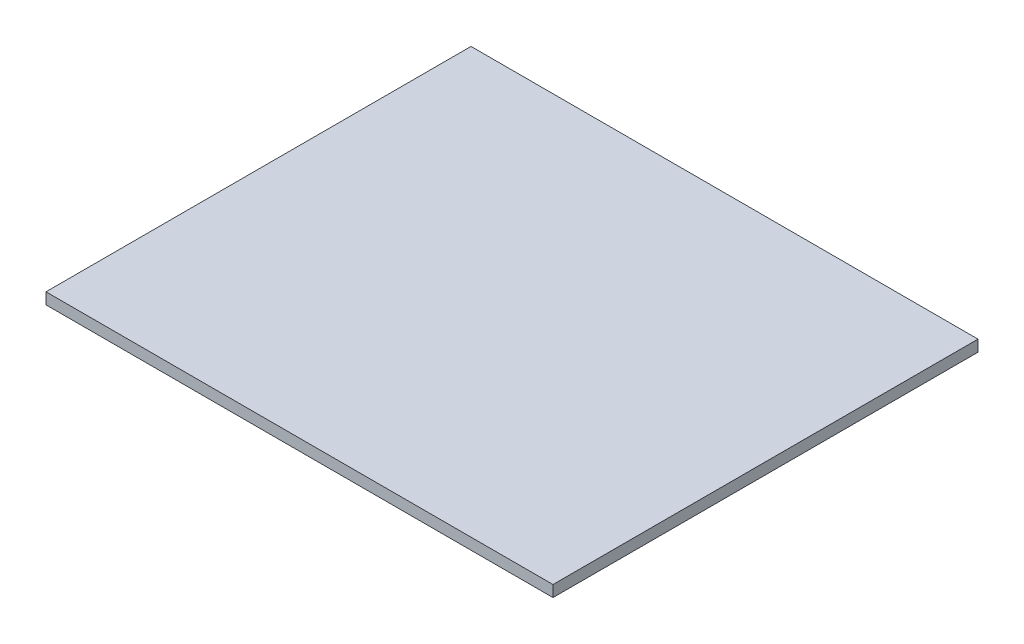
ISO-10303-21;
HEADER;
FILE_DESCRIPTION(('STEP AP214'),'2;1');
FILE_NAME('part.step','',(''),(''),'','','');
FILE_SCHEMA(('AUTOMOTIVE_DESIGN { 1 0 10303 214 1 1 1 1 }'));
ENDSEC;
DATA;
#1=APPLICATION_CONTEXT('core data for automotive mechanical design processes');
#2=APPLICATION_PROTOCOL_DEFINITION('international standard','automotive_design',2000,#1);
#3=PRODUCT_CONTEXT('',#1,'mechanical');
#4=PRODUCT('Part','Part','',(#3));
#5=PRODUCT_RELATED_PRODUCT_CATEGORY('part','',(#4));
#6=PRODUCT_DEFINITION_FORMATION('','',#4);
#7=PRODUCT_DEFINITION_CONTEXT('part definition',#1,'design');
#8=PRODUCT_DEFINITION('design','',#6,#7);
#9=PRODUCT_DEFINITION_SHAPE('','',#8);
#10=(LENGTH_UNIT() NAMED_UNIT(*) SI_UNIT(.MILLI.,.METRE.));
#11=(NAMED_UNIT(*) PLANE_ANGLE_UNIT() SI_UNIT($,.RADIAN.));
#12=(NAMED_UNIT(*) SI_UNIT($,.STERADIAN.) SOLID_ANGLE_UNIT());
#13=UNCERTAINTY_MEASURE_WITH_UNIT(LENGTH_MEASURE(1.E-05),#10,'distance_accuracy_value','');
#14=(GEOMETRIC_REPRESENTATION_CONTEXT(3) GLOBAL_UNCERTAINTY_ASSIGNED_CONTEXT((#13)) GLOBAL_UNIT_ASSIGNED_CONTEXT((#10,
#11,#12)) REPRESENTATION_CONTEXT('',''));
#15=CARTESIAN_POINT('',(0.,0.,0.));
#16=DIRECTION('',(0.,0.,1.));
#17=DIRECTION('',(1.,0.,0.));
#18=AXIS2_PLACEMENT_3D('',#15,#16,#17);
#19=CARTESIAN_POINT('',(178.93175074184,8.,-150.));
#20=DIRECTION('',(-1.,0.,0.));
#21=DIRECTION('',(0.,0.,1.));
#22=AXIS2_PLACEMENT_3D('',#19,#20,#21);
#23=PLANE('',#22);
#24=DIRECTION('',(0.,0.,-1.));
#25=VECTOR('',#24,1.);
#26=CARTESIAN_POINT('',(178.93175074184,0.,-150.));
#27=LINE('',#26,#25);
#28=CARTESIAN_POINT('',(178.93175074184,0.,150.));
#29=VERTEX_POINT('',#28);
#30=CARTESIAN_POINT('',(178.93175074184,0.,-150.));
#31=VERTEX_POINT('',#30);
#32=EDGE_CURVE('E98',#29,#31,#27,.T.);
#33=ORIENTED_EDGE('',*,*,#32,.T.);
#34=DIRECTION('',(0.,-1.,0.));
#35=VECTOR('',#34,1.);
#36=CARTESIAN_POINT('',(178.93175074184,8.,-150.));
#37=LINE('',#36,#35);
#38=CARTESIAN_POINT('',(178.93175074184,8.,-150.));
#39=VERTEX_POINT('',#38);
#40=EDGE_CURVE('E11',#39,#31,#37,.T.);
#41=ORIENTED_EDGE('',*,*,#40,.F.);
#42=DIRECTION('',(0.,0.,-1.));
#43=VECTOR('',#42,1.);
#44=CARTESIAN_POINT('',(178.93175074184,8.,-150.));
#45=LINE('',#44,#43);
#46=CARTESIAN_POINT('',(178.93175074184,8.,150.));
#47=VERTEX_POINT('',#46);
#48=EDGE_CURVE('E86',#47,#39,#45,.T.);
#49=ORIENTED_EDGE('',*,*,#48,.F.);
#50=DIRECTION('',(0.,-1.,0.));
#51=VECTOR('',#50,1.);
#52=CARTESIAN_POINT('',(178.93175074184,8.,150.));
#53=LINE('',#52,#51);
#54=EDGE_CURVE('E94',#47,#29,#53,.T.);
#55=ORIENTED_EDGE('',*,*,#54,.T.);
#56=EDGE_LOOP('',(#33,#41,#49,#55));
#57=FACE_BOUND('',#56,.T.);
#58=ADVANCED_FACE('F35',(#57),#23,.F.);
#59=CARTESIAN_POINT('',(-178.93175074184,8.,-150.));
#60=DIRECTION('',(0.,0.,1.));
#61=DIRECTION('',(1.,0.,0.));
#62=AXIS2_PLACEMENT_3D('',#59,#60,#61);
#63=PLANE('',#62);
#64=DIRECTION('',(-1.,0.,0.));
#65=VECTOR('',#64,1.);
#66=CARTESIAN_POINT('',(-178.93175074184,0.,-150.));
#67=LINE('',#66,#65);
#68=CARTESIAN_POINT('',(-178.93175074184,0.,-150.));
#69=VERTEX_POINT('',#68);
#70=EDGE_CURVE('E90',#31,#69,#67,.T.);
#71=ORIENTED_EDGE('',*,*,#70,.T.);
#72=DIRECTION('',(0.,-1.,0.));
#73=VECTOR('',#72,1.);
#74=CARTESIAN_POINT('',(-178.93175074184,8.,-150.));
#75=LINE('',#74,#73);
#76=CARTESIAN_POINT('',(-178.93175074184,8.,-150.));
#77=VERTEX_POINT('',#76);
#78=EDGE_CURVE('E43',#77,#69,#75,.T.);
#79=ORIENTED_EDGE('',*,*,#78,.F.);
#80=DIRECTION('',(-1.,0.,0.));
#81=VECTOR('',#80,1.);
#82=CARTESIAN_POINT('',(-178.93175074184,8.,-150.));
#83=LINE('',#82,#81);
#84=EDGE_CURVE('E81',#39,#77,#83,.T.);
#85=ORIENTED_EDGE('',*,*,#84,.F.);
#86=ORIENTED_EDGE('',*,*,#40,.T.);
#87=EDGE_LOOP('',(#71,#79,#85,#86));
#88=FACE_BOUND('',#87,.T.);
#89=ADVANCED_FACE('F89',(#88),#63,.F.);
#90=CARTESIAN_POINT('',(-178.93175074184,8.,-150.));
#91=DIRECTION('',(1.,0.,0.));
#92=DIRECTION('',(0.,0.,-1.));
#93=AXIS2_PLACEMENT_3D('',#90,#91,#92);
#94=PLANE('',#93);
#95=DIRECTION('',(0.,0.,1.));
#96=VECTOR('',#95,1.);
#97=CARTESIAN_POINT('',(-178.93175074184,0.,-150.));
#98=LINE('',#97,#96);
#99=CARTESIAN_POINT('',(-178.93175074184,0.,150.));
#100=VERTEX_POINT('',#99);
#101=EDGE_CURVE('E68',#69,#100,#98,.T.);
#102=ORIENTED_EDGE('',*,*,#101,.T.);
#103=DIRECTION('',(0.,-1.,0.));
#104=VECTOR('',#103,1.);
#105=CARTESIAN_POINT('',(-178.93175074184,8.,150.));
#106=LINE('',#105,#104);
#107=CARTESIAN_POINT('',(-178.93175074184,8.,150.));
#108=VERTEX_POINT('',#107);
#109=EDGE_CURVE('E91',#108,#100,#106,.T.);
#110=ORIENTED_EDGE('',*,*,#109,.F.);
#111=DIRECTION('',(0.,0.,1.));
#112=VECTOR('',#111,1.);
#113=CARTESIAN_POINT('',(-178.93175074184,8.,-150.));
#114=LINE('',#113,#112);
#115=EDGE_CURVE('E84',#77,#108,#114,.T.);
#116=ORIENTED_EDGE('',*,*,#115,.F.);
#117=ORIENTED_EDGE('',*,*,#78,.T.);
#118=EDGE_LOOP('',(#102,#110,#116,#117));
#119=FACE_BOUND('',#118,.T.);
#120=ADVANCED_FACE('F92',(#119),#94,.F.);
#121=CARTESIAN_POINT('',(-178.93175074184,8.,150.));
#122=DIRECTION('',(0.,0.,-1.));
#123=DIRECTION('',(-1.,0.,0.));
#124=AXIS2_PLACEMENT_3D('',#121,#122,#123);
#125=PLANE('',#124);
#126=DIRECTION('',(1.,0.,0.));
#127=VECTOR('',#126,1.);
#128=CARTESIAN_POINT('',(-178.93175074184,0.,150.));
#129=LINE('',#128,#127);
#130=EDGE_CURVE('E74',#100,#29,#129,.T.);
#131=ORIENTED_EDGE('',*,*,#130,.T.);
#132=ORIENTED_EDGE('',*,*,#54,.F.);
#133=DIRECTION('',(1.,0.,0.));
#134=VECTOR('',#133,1.);
#135=CARTESIAN_POINT('',(-178.93175074184,8.,150.));
#136=LINE('',#135,#134);
#137=EDGE_CURVE('E51',#108,#47,#136,.T.);
#138=ORIENTED_EDGE('',*,*,#137,.F.);
#139=ORIENTED_EDGE('',*,*,#109,.T.);
#140=EDGE_LOOP('',(#131,#132,#138,#139));
#141=FACE_BOUND('',#140,.T.);
#142=ADVANCED_FACE('F105',(#141),#125,.F.);
#143=CARTESIAN_POINT('',(0.,8.,0.));
#144=DIRECTION('',(0.,1.,0.));
#145=DIRECTION('',(0.,0.,1.));
#146=AXIS2_PLACEMENT_3D('',#143,#144,#145);
#147=PLANE('',#146);
#148=ORIENTED_EDGE('',*,*,#48,.T.);
#149=ORIENTED_EDGE('',*,*,#84,.T.);
#150=ORIENTED_EDGE('',*,*,#115,.T.);
#151=ORIENTED_EDGE('',*,*,#137,.T.);
#152=EDGE_LOOP('',(#148,#149,#150,#151));
#153=FACE_BOUND('',#152,.T.);
#154=ADVANCED_FACE('F82',(#153),#147,.T.);
#155=CARTESIAN_POINT('',(0.,0.,0.));
#156=DIRECTION('',(0.,1.,0.));
#157=DIRECTION('',(0.,0.,1.));
#158=AXIS2_PLACEMENT_3D('',#155,#156,#157);
#159=PLANE('',#158);
#160=ORIENTED_EDGE('',*,*,#32,.F.);
#161=ORIENTED_EDGE('',*,*,#130,.F.);
#162=ORIENTED_EDGE('',*,*,#101,.F.);
#163=ORIENTED_EDGE('',*,*,#70,.F.);
#164=EDGE_LOOP('',(#160,#161,#162,#163));
#165=FACE_BOUND('',#164,.T.);
#166=ADVANCED_FACE('F108',(#165),#159,.F.);
#167=CLOSED_SHELL('',(#58,#89,#120,#142,#154,#166));
#168=MANIFOLD_SOLID_BREP('B2',#167);
#169=ADVANCED_BREP_SHAPE_REPRESENTATION('',(#18,#168),#14);
#170=SHAPE_DEFINITION_REPRESENTATION(#9,#169);
ENDSEC;
END-ISO-10303-21;
